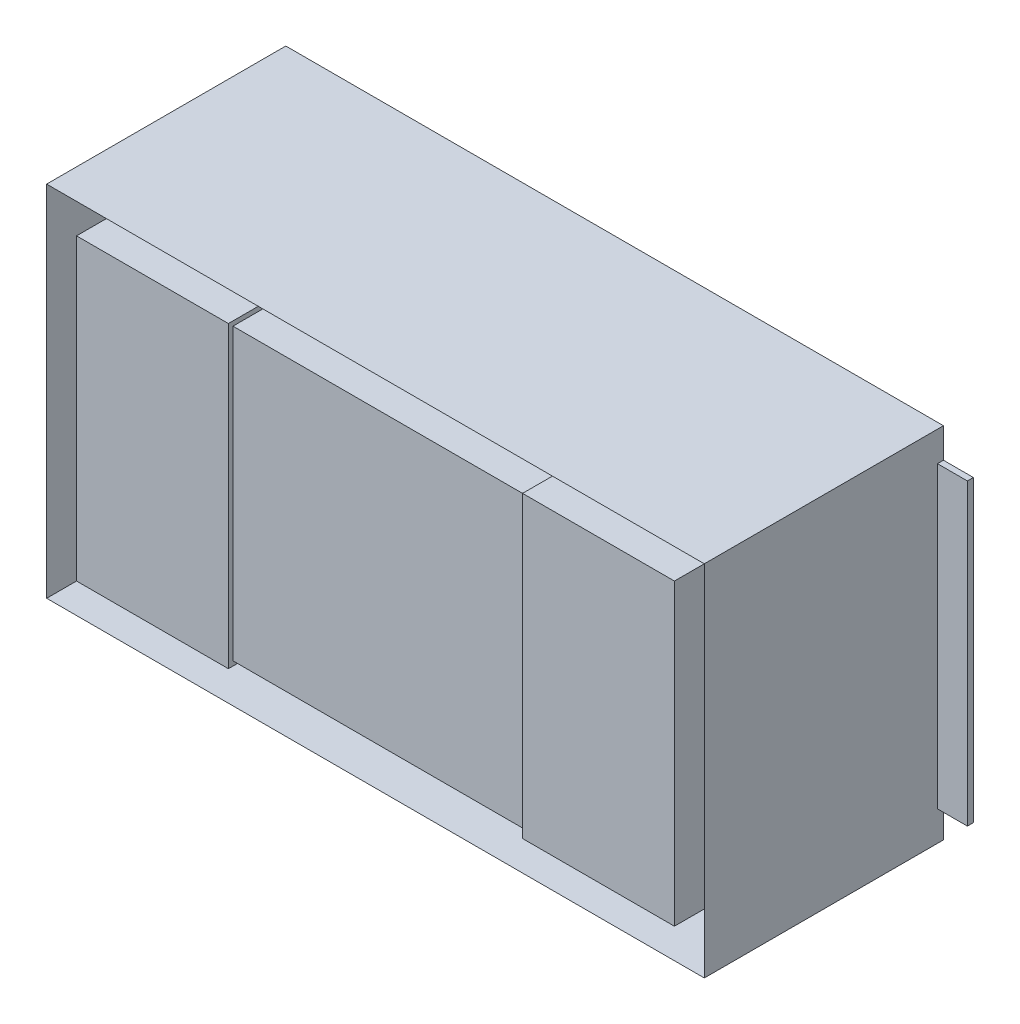
ISO-10303-21;
HEADER;
FILE_DESCRIPTION(('STEP AP214'),'2;1');
FILE_NAME('part.step','',(''),(''),'','','');
FILE_SCHEMA(('AUTOMOTIVE_DESIGN { 1 0 10303 214 1 1 1 1 }'));
ENDSEC;
DATA;
#1=APPLICATION_CONTEXT('core data for automotive mechanical design processes');
#2=APPLICATION_PROTOCOL_DEFINITION('international standard','automotive_design',2000,#1);
#3=PRODUCT_CONTEXT('',#1,'mechanical');
#4=PRODUCT('Part','Part','',(#3));
#5=PRODUCT_RELATED_PRODUCT_CATEGORY('part','',(#4));
#6=PRODUCT_DEFINITION_FORMATION('','',#4);
#7=PRODUCT_DEFINITION_CONTEXT('part definition',#1,'design');
#8=PRODUCT_DEFINITION('design','',#6,#7);
#9=PRODUCT_DEFINITION_SHAPE('','',#8);
#10=(LENGTH_UNIT() NAMED_UNIT(*) SI_UNIT(.MILLI.,.METRE.));
#11=(NAMED_UNIT(*) PLANE_ANGLE_UNIT() SI_UNIT($,.RADIAN.));
#12=(NAMED_UNIT(*) SI_UNIT($,.STERADIAN.) SOLID_ANGLE_UNIT());
#13=UNCERTAINTY_MEASURE_WITH_UNIT(LENGTH_MEASURE(1.E-05),#10,'distance_accuracy_value','');
#14=(GEOMETRIC_REPRESENTATION_CONTEXT(3) GLOBAL_UNCERTAINTY_ASSIGNED_CONTEXT((#13)) GLOBAL_UNIT_ASSIGNED_CONTEXT((#10,
#11,#12)) REPRESENTATION_CONTEXT('',''));
#15=CARTESIAN_POINT('',(0.,0.,0.));
#16=DIRECTION('',(0.,0.,1.));
#17=DIRECTION('',(1.,0.,0.));
#18=AXIS2_PLACEMENT_3D('',#15,#16,#17);
#19=CARTESIAN_POINT('',(-0.5999988,0.2500122,0.0762));
#20=DIRECTION('',(-1.,0.,0.));
#21=DIRECTION('',(0.,0.,1.));
#22=AXIS2_PLACEMENT_3D('',#19,#20,#21);
#23=PLANE('',#22);
#24=DIRECTION('',(0.,0.,1.));
#25=VECTOR('',#24,1.);
#26=CARTESIAN_POINT('',(-0.5999988,-0.2500081333333,0.0762));
#27=LINE('',#26,#25);
#28=CARTESIAN_POINT('',(-0.5999988,-0.2500081333333,0.0762));
#29=VERTEX_POINT('',#28);
#30=CARTESIAN_POINT('',(-0.5999988,-0.2500081333333,0.0862));
#31=VERTEX_POINT('',#30);
#32=EDGE_CURVE('P0_E355',#29,#31,#27,.T.);
#33=ORIENTED_EDGE('',*,*,#32,.T.);
#34=DIRECTION('',(0.,-1.,0.));
#35=VECTOR('',#34,1.);
#36=CARTESIAN_POINT('',(-0.5999988,0.2500081333333,0.0862));
#37=LINE('',#36,#35);
#38=CARTESIAN_POINT('',(-0.5999988,0.2500081333333,0.0862));
#39=VERTEX_POINT('',#38);
#40=EDGE_CURVE('P0_E276',#39,#31,#37,.T.);
#41=ORIENTED_EDGE('',*,*,#40,.F.);
#42=DIRECTION('',(0.,0.,1.));
#43=VECTOR('',#42,1.);
#44=CARTESIAN_POINT('',(-0.5999988,0.2500081333333,0.0762));
#45=LINE('',#44,#43);
#46=CARTESIAN_POINT('',(-0.5999988,0.2500081333333,0.0762));
#47=VERTEX_POINT('',#46);
#48=EDGE_CURVE('P0_E323',#47,#39,#45,.T.);
#49=ORIENTED_EDGE('',*,*,#48,.F.);
#50=DIRECTION('',(0.,-1.,0.));
#51=VECTOR('',#50,1.);
#52=CARTESIAN_POINT('',(-0.5999988,0.2500081333333,0.0762));
#53=LINE('',#52,#51);
#54=EDGE_CURVE('P0_E381',#47,#29,#53,.T.);
#55=ORIENTED_EDGE('',*,*,#54,.T.);
#56=EDGE_LOOP('',(#33,#41,#49,#55));
#57=FACE_BOUND('',#56,.T.);
#58=ADVANCED_FACE('P0_F18',(#57),#23,.T.);
#59=CARTESIAN_POINT('',(0.5999988,-0.2500122,0.0762));
#60=DIRECTION('',(1.,0.,0.));
#61=DIRECTION('',(0.,1.,0.));
#62=AXIS2_PLACEMENT_3D('',#59,#60,#61);
#63=PLANE('',#62);
#64=DIRECTION('',(0.,0.,1.));
#65=VECTOR('',#64,1.);
#66=CARTESIAN_POINT('',(0.5999988,0.2500081333333,0.0762));
#67=LINE('',#66,#65);
#68=CARTESIAN_POINT('',(0.5999988,0.2500081333333,0.0762));
#69=VERTEX_POINT('',#68);
#70=CARTESIAN_POINT('',(0.5999988,0.2500081333333,0.0862));
#71=VERTEX_POINT('',#70);
#72=EDGE_CURVE('P0_E421',#69,#71,#67,.T.);
#73=ORIENTED_EDGE('',*,*,#72,.T.);
#74=DIRECTION('',(0.,1.,0.));
#75=VECTOR('',#74,1.);
#76=CARTESIAN_POINT('',(0.5999988,-0.2500081333333,0.0862));
#77=LINE('',#76,#75);
#78=CARTESIAN_POINT('',(0.5999988,-0.2500081333333,0.0862));
#79=VERTEX_POINT('',#78);
#80=EDGE_CURVE('P0_E277',#79,#71,#77,.T.);
#81=ORIENTED_EDGE('',*,*,#80,.F.);
#82=DIRECTION('',(0.,0.,1.));
#83=VECTOR('',#82,1.);
#84=CARTESIAN_POINT('',(0.5999988,-0.2500081333333,0.0762));
#85=LINE('',#84,#83);
#86=CARTESIAN_POINT('',(0.5999988,-0.2500081333333,0.0762));
#87=VERTEX_POINT('',#86);
#88=EDGE_CURVE('P0_E404',#87,#79,#85,.T.);
#89=ORIENTED_EDGE('',*,*,#88,.F.);
#90=DIRECTION('',(0.,1.,0.));
#91=VECTOR('',#90,1.);
#92=CARTESIAN_POINT('',(0.5999988,-0.2500081333333,0.0762));
#93=LINE('',#92,#91);
#94=EDGE_CURVE('P0_E269',#87,#69,#93,.T.);
#95=ORIENTED_EDGE('',*,*,#94,.T.);
#96=EDGE_LOOP('',(#73,#81,#89,#95));
#97=FACE_BOUND('',#96,.T.);
#98=ADVANCED_FACE('P0_F541',(#97),#63,.T.);
#99=CARTESIAN_POINT('',(-0.5,0.25,0.0762));
#100=DIRECTION('',(-1.,0.,0.));
#101=DIRECTION('',(0.,0.,1.));
#102=AXIS2_PLACEMENT_3D('',#99,#100,#101);
#103=PLANE('',#102);
#104=DIRECTION('',(0.,1.04273504267004E-05,0.999999999945635));
#105=VECTOR('',#104,1.);
#106=CARTESIAN_POINT('',(-0.5,-0.2500040666667,0.0862));
#107=LINE('',#106,#105);
#108=CARTESIAN_POINT('',(-0.5,-0.2500040666667,0.0862));
#109=VERTEX_POINT('',#108);
#110=CARTESIAN_POINT('',(-0.5,-0.25,0.4762));
#111=VERTEX_POINT('',#110);
#112=EDGE_CURVE('P0_E352',#109,#111,#107,.T.);
#113=ORIENTED_EDGE('',*,*,#112,.T.);
#114=DIRECTION('',(0.,-1.,0.));
#115=VECTOR('',#114,1.);
#116=CARTESIAN_POINT('',(-0.5,0.25,0.4762));
#117=LINE('',#116,#115);
#118=CARTESIAN_POINT('',(-0.5,0.25,0.4762));
#119=VERTEX_POINT('',#118);
#120=EDGE_CURVE('P0_E11',#119,#111,#117,.T.);
#121=ORIENTED_EDGE('',*,*,#120,.F.);
#122=DIRECTION('',(0.,-1.04273504267004E-05,0.999999999945635));
#123=VECTOR('',#122,1.);
#124=CARTESIAN_POINT('',(-0.5,0.2500040666667,0.0862));
#125=LINE('',#124,#123);
#126=CARTESIAN_POINT('',(-0.5,0.2500040666667,0.0862));
#127=VERTEX_POINT('',#126);
#128=EDGE_CURVE('P0_E318',#127,#119,#125,.T.);
#129=ORIENTED_EDGE('',*,*,#128,.F.);
#130=DIRECTION('',(0.,-1.,0.));
#131=VECTOR('',#130,1.);
#132=CARTESIAN_POINT('',(-0.5,0.2500040666667,0.0862));
#133=LINE('',#132,#131);
#134=EDGE_CURVE('P0_E287',#127,#109,#133,.T.);
#135=ORIENTED_EDGE('',*,*,#134,.T.);
#136=EDGE_LOOP('',(#113,#121,#129,#135));
#137=FACE_BOUND('',#136,.T.);
#138=ADVANCED_FACE('P0_F549',(#137),#103,.T.);
#139=CARTESIAN_POINT('',(0.,0.,0.4762));
#140=DIRECTION('',(0.,0.,1.));
#141=DIRECTION('',(1.,0.,0.));
#142=AXIS2_PLACEMENT_3D('',#139,#140,#141);
#143=PLANE('',#142);
#144=DIRECTION('',(1.,0.,0.));
#145=VECTOR('',#144,1.);
#146=CARTESIAN_POINT('',(0.246,-0.25,0.4762));
#147=LINE('',#146,#145);
#148=CARTESIAN_POINT('',(0.246,-0.25,0.4762));
#149=VERTEX_POINT('',#148);
#150=CARTESIAN_POINT('',(0.5,-0.25,0.4762));
#151=VERTEX_POINT('',#150);
#152=EDGE_CURVE('P0_E247',#149,#151,#147,.T.);
#153=ORIENTED_EDGE('',*,*,#152,.T.);
#154=DIRECTION('',(0.,1.,0.));
#155=VECTOR('',#154,1.);
#156=CARTESIAN_POINT('',(0.5,-0.25,0.4762));
#157=LINE('',#156,#155);
#158=CARTESIAN_POINT('',(0.5,0.25,0.4762));
#159=VERTEX_POINT('',#158);
#160=EDGE_CURVE('P0_E286',#151,#159,#157,.T.);
#161=ORIENTED_EDGE('',*,*,#160,.T.);
#162=DIRECTION('',(-1.,0.,0.));
#163=VECTOR('',#162,1.);
#164=CARTESIAN_POINT('',(0.5,0.25,0.4762));
#165=LINE('',#164,#163);
#166=CARTESIAN_POINT('',(0.246,0.25,0.4762));
#167=VERTEX_POINT('',#166);
#168=EDGE_CURVE('P0_E415',#159,#167,#165,.T.);
#169=ORIENTED_EDGE('',*,*,#168,.T.);
#170=DIRECTION('',(0.,1.,0.));
#171=VECTOR('',#170,1.);
#172=CARTESIAN_POINT('',(0.246,-0.25,0.4762));
#173=LINE('',#172,#171);
#174=EDGE_CURVE('P0_E250',#149,#167,#173,.T.);
#175=ORIENTED_EDGE('',*,*,#174,.F.);
#176=EDGE_LOOP('',(#153,#161,#169,#175));
#177=FACE_BOUND('',#176,.T.);
#178=ADVANCED_FACE('P0_F578',(#177),#143,.T.);
#179=CARTESIAN_POINT('',(0.,0.,0.4762));
#180=DIRECTION('',(0.,0.,1.));
#181=DIRECTION('',(1.,0.,0.));
#182=AXIS2_PLACEMENT_3D('',#179,#180,#181);
#183=PLANE('',#182);
#184=DIRECTION('',(-1.,0.,0.));
#185=VECTOR('',#184,1.);
#186=CARTESIAN_POINT('',(-0.246,0.25,0.4762));
#187=LINE('',#186,#185);
#188=CARTESIAN_POINT('',(-0.246,0.25,0.4762));
#189=VERTEX_POINT('',#188);
#190=EDGE_CURVE('P0_E313',#189,#119,#187,.T.);
#191=ORIENTED_EDGE('',*,*,#190,.T.);
#192=ORIENTED_EDGE('',*,*,#120,.T.);
#193=DIRECTION('',(1.,0.,0.));
#194=VECTOR('',#193,1.);
#195=CARTESIAN_POINT('',(-0.5,-0.25,0.4762));
#196=LINE('',#195,#194);
#197=CARTESIAN_POINT('',(-0.246,-0.25,0.4762));
#198=VERTEX_POINT('',#197);
#199=EDGE_CURVE('P0_E356',#111,#198,#196,.T.);
#200=ORIENTED_EDGE('',*,*,#199,.T.);
#201=DIRECTION('',(0.,1.,0.));
#202=VECTOR('',#201,1.);
#203=CARTESIAN_POINT('',(-0.246,-0.25,0.4762));
#204=LINE('',#203,#202);
#205=EDGE_CURVE('P0_E29',#198,#189,#204,.T.);
#206=ORIENTED_EDGE('',*,*,#205,.T.);
#207=EDGE_LOOP('',(#191,#192,#200,#206));
#208=FACE_BOUND('',#207,.T.);
#209=ADVANCED_FACE('P0_F1244',(#208),#183,.T.);
#210=CARTESIAN_POINT('',(-0.246,-0.25,0.0762));
#211=DIRECTION('',(-1.,0.,0.));
#212=DIRECTION('',(0.,0.,1.));
#213=AXIS2_PLACEMENT_3D('',#210,#211,#212);
#214=PLANE('',#213);
#215=DIRECTION('',(0.,0.,-1.));
#216=VECTOR('',#215,1.);
#217=CARTESIAN_POINT('',(-0.246,-0.24238,0.46858));
#218=LINE('',#217,#216);
#219=CARTESIAN_POINT('',(-0.246,-0.24238,0.46858));
#220=VERTEX_POINT('',#219);
#221=CARTESIAN_POINT('',(-0.246,-0.24238,0.0862));
#222=VERTEX_POINT('',#221);
#223=EDGE_CURVE('P0_E43',#220,#222,#218,.T.);
#224=ORIENTED_EDGE('',*,*,#223,.F.);
#225=DIRECTION('',(0.,1.,0.));
#226=VECTOR('',#225,1.);
#227=CARTESIAN_POINT('',(-0.246,-0.24238,0.46858));
#228=LINE('',#227,#226);
#229=CARTESIAN_POINT('',(-0.246,0.24238,0.46858));
#230=VERTEX_POINT('',#229);
#231=EDGE_CURVE('P0_E267',#220,#230,#228,.T.);
#232=ORIENTED_EDGE('',*,*,#231,.T.);
#233=DIRECTION('',(0.,0.,-1.));
#234=VECTOR('',#233,1.);
#235=CARTESIAN_POINT('',(-0.246,0.24238,0.46858));
#236=LINE('',#235,#234);
#237=CARTESIAN_POINT('',(-0.246,0.24238,0.0862));
#238=VERTEX_POINT('',#237);
#239=EDGE_CURVE('P0_E300',#230,#238,#236,.T.);
#240=ORIENTED_EDGE('',*,*,#239,.T.);
#241=DIRECTION('',(0.,1.,0.));
#242=VECTOR('',#241,1.);
#243=CARTESIAN_POINT('',(-0.246,0.24238,0.0862));
#244=LINE('',#243,#242);
#245=CARTESIAN_POINT('',(-0.246,0.2500040666667,0.0862));
#246=VERTEX_POINT('',#245);
#247=EDGE_CURVE('P0_E22',#238,#246,#244,.T.);
#248=ORIENTED_EDGE('',*,*,#247,.T.);
#249=DIRECTION('',(0.,-1.04273504267004E-05,0.999999999945635));
#250=VECTOR('',#249,1.);
#251=CARTESIAN_POINT('',(-0.246,0.2500040666667,0.0862));
#252=LINE('',#251,#250);
#253=EDGE_CURVE('P0_E317',#246,#189,#252,.T.);
#254=ORIENTED_EDGE('',*,*,#253,.T.);
#255=ORIENTED_EDGE('',*,*,#205,.F.);
#256=DIRECTION('',(0.,1.04273504267004E-05,0.999999999945635));
#257=VECTOR('',#256,1.);
#258=CARTESIAN_POINT('',(-0.246,-0.2500040666667,0.0862));
#259=LINE('',#258,#257);
#260=CARTESIAN_POINT('',(-0.246,-0.2500040666667,0.0862));
#261=VERTEX_POINT('',#260);
#262=EDGE_CURVE('P0_E369',#261,#198,#259,.T.);
#263=ORIENTED_EDGE('',*,*,#262,.F.);
#264=DIRECTION('',(0.,1.,0.));
#265=VECTOR('',#264,1.);
#266=CARTESIAN_POINT('',(-0.246,-0.2500040666667,0.0862));
#267=LINE('',#266,#265);
#268=EDGE_CURVE('P0_E331',#261,#222,#267,.T.);
#269=ORIENTED_EDGE('',*,*,#268,.T.);
#270=EDGE_LOOP('',(#224,#232,#240,#248,#254,#255,#263,#269));
#271=FACE_BOUND('',#270,.T.);
#272=ADVANCED_FACE('P0_F506',(#271),#214,.F.);
#273=CARTESIAN_POINT('',(-0.246,-0.24238,0.4762));
#274=DIRECTION('',(0.,1.,0.));
#275=DIRECTION('',(1.,0.,0.));
#276=AXIS2_PLACEMENT_3D('',#273,#274,#275);
#277=PLANE('',#276);
#278=DIRECTION('',(0.,0.,1.));
#279=VECTOR('',#278,1.);
#280=CARTESIAN_POINT('',(-0.1999996,-0.24238,0.08382));
#281=LINE('',#280,#279);
#282=CARTESIAN_POINT('',(-0.1999996,-0.24238,0.08382));
#283=VERTEX_POINT('',#282);
#284=CARTESIAN_POINT('',(-0.1999996,-0.24238,0.0862));
#285=VERTEX_POINT('',#284);
#286=EDGE_CURVE('P0_E301',#283,#285,#281,.T.);
#287=ORIENTED_EDGE('',*,*,#286,.F.);
#288=DIRECTION('',(1.,0.,0.));
#289=VECTOR('',#288,1.);
#290=CARTESIAN_POINT('',(-0.1999996,-0.24238,0.08382));
#291=LINE('',#290,#289);
#292=CARTESIAN_POINT('',(0.1999996,-0.24238,0.08382));
#293=VERTEX_POINT('',#292);
#294=EDGE_CURVE('P0_E278',#283,#293,#291,.T.);
#295=ORIENTED_EDGE('',*,*,#294,.T.);
#296=DIRECTION('',(0.,0.,1.));
#297=VECTOR('',#296,1.);
#298=CARTESIAN_POINT('',(0.1999996,-0.24238,0.08382));
#299=LINE('',#298,#297);
#300=CARTESIAN_POINT('',(0.1999996,-0.24238,0.0862));
#301=VERTEX_POINT('',#300);
#302=EDGE_CURVE('P0_E361',#293,#301,#299,.T.);
#303=ORIENTED_EDGE('',*,*,#302,.T.);
#304=DIRECTION('',(1.,0.,0.));
#305=VECTOR('',#304,1.);
#306=CARTESIAN_POINT('',(0.1999996,-0.24238,0.0862));
#307=LINE('',#306,#305);
#308=CARTESIAN_POINT('',(0.246,-0.24238,0.0862));
#309=VERTEX_POINT('',#308);
#310=EDGE_CURVE('P0_E310',#301,#309,#307,.T.);
#311=ORIENTED_EDGE('',*,*,#310,.T.);
#312=DIRECTION('',(0.,0.,-1.));
#313=VECTOR('',#312,1.);
#314=CARTESIAN_POINT('',(0.246,-0.24238,0.46858));
#315=LINE('',#314,#313);
#316=CARTESIAN_POINT('',(0.246,-0.24238,0.46858));
#317=VERTEX_POINT('',#316);
#318=EDGE_CURVE('P0_E241',#317,#309,#315,.T.);
#319=ORIENTED_EDGE('',*,*,#318,.F.);
#320=DIRECTION('',(1.,0.,0.));
#321=VECTOR('',#320,1.);
#322=CARTESIAN_POINT('',(-0.246,-0.24238,0.46858));
#323=LINE('',#322,#321);
#324=EDGE_CURVE('P0_E366',#220,#317,#323,.T.);
#325=ORIENTED_EDGE('',*,*,#324,.F.);
#326=ORIENTED_EDGE('',*,*,#223,.T.);
#327=DIRECTION('',(1.,0.,0.));
#328=VECTOR('',#327,1.);
#329=CARTESIAN_POINT('',(-0.246,-0.24238,0.0862));
#330=LINE('',#329,#328);
#331=EDGE_CURVE('P0_E333',#222,#285,#330,.T.);
#332=ORIENTED_EDGE('',*,*,#331,.T.);
#333=EDGE_LOOP('',(#287,#295,#303,#311,#319,#325,#326,#332));
#334=FACE_BOUND('',#333,.T.);
#335=ADVANCED_FACE('P0_F510',(#334),#277,.F.);
#336=CARTESIAN_POINT('',(-0.246,0.25,0.46858));
#337=DIRECTION('',(0.,0.,-1.));
#338=DIRECTION('',(0.,-1.,0.));
#339=AXIS2_PLACEMENT_3D('',#336,#337,#338);
#340=PLANE('',#339);
#341=ORIENTED_EDGE('',*,*,#231,.F.);
#342=ORIENTED_EDGE('',*,*,#324,.T.);
#343=DIRECTION('',(0.,1.,0.));
#344=VECTOR('',#343,1.);
#345=CARTESIAN_POINT('',(0.246,-0.24238,0.46858));
#346=LINE('',#345,#344);
#347=CARTESIAN_POINT('',(0.246,0.24238,0.46858));
#348=VERTEX_POINT('',#347);
#349=EDGE_CURVE('P0_E302',#317,#348,#346,.T.);
#350=ORIENTED_EDGE('',*,*,#349,.T.);
#351=DIRECTION('',(-1.,0.,0.));
#352=VECTOR('',#351,1.);
#353=CARTESIAN_POINT('',(0.246,0.24238,0.46858));
#354=LINE('',#353,#352);
#355=EDGE_CURVE('P0_E490',#348,#230,#354,.T.);
#356=ORIENTED_EDGE('',*,*,#355,.T.);
#357=EDGE_LOOP('',(#341,#342,#350,#356));
#358=FACE_BOUND('',#357,.T.);
#359=ADVANCED_FACE('P0_F508',(#358),#340,.F.);
#360=CARTESIAN_POINT('',(-0.246,0.24238,0.0762));
#361=DIRECTION('',(0.,-1.,0.));
#362=DIRECTION('',(0.,0.,-1.));
#363=AXIS2_PLACEMENT_3D('',#360,#361,#362);
#364=PLANE('',#363);
#365=ORIENTED_EDGE('',*,*,#239,.F.);
#366=ORIENTED_EDGE('',*,*,#355,.F.);
#367=DIRECTION('',(0.,0.,-1.));
#368=VECTOR('',#367,1.);
#369=CARTESIAN_POINT('',(0.246,0.24238,0.46858));
#370=LINE('',#369,#368);
#371=CARTESIAN_POINT('',(0.246,0.24238,0.0862));
#372=VERTEX_POINT('',#371);
#373=EDGE_CURVE('P0_E306',#348,#372,#370,.T.);
#374=ORIENTED_EDGE('',*,*,#373,.T.);
#375=DIRECTION('',(1.,0.,0.));
#376=VECTOR('',#375,1.);
#377=CARTESIAN_POINT('',(0.1999996,0.24238,0.0862));
#378=LINE('',#377,#376);
#379=CARTESIAN_POINT('',(0.1999996,0.24238,0.0862));
#380=VERTEX_POINT('',#379);
#381=EDGE_CURVE('P0_E283',#380,#372,#378,.T.);
#382=ORIENTED_EDGE('',*,*,#381,.F.);
#383=DIRECTION('',(0.,0.,1.));
#384=VECTOR('',#383,1.);
#385=CARTESIAN_POINT('',(0.1999996,0.24238,0.08382));
#386=LINE('',#385,#384);
#387=CARTESIAN_POINT('',(0.1999996,0.24238,0.08382));
#388=VERTEX_POINT('',#387);
#389=EDGE_CURVE('P0_E365',#388,#380,#386,.T.);
#390=ORIENTED_EDGE('',*,*,#389,.F.);
#391=DIRECTION('',(-1.,0.,0.));
#392=VECTOR('',#391,1.);
#393=CARTESIAN_POINT('',(0.1999996,0.24238,0.08382));
#394=LINE('',#393,#392);
#395=CARTESIAN_POINT('',(-0.1999996,0.24238,0.08382));
#396=VERTEX_POINT('',#395);
#397=EDGE_CURVE('P0_E282',#388,#396,#394,.T.);
#398=ORIENTED_EDGE('',*,*,#397,.T.);
#399=DIRECTION('',(0.,0.,1.));
#400=VECTOR('',#399,1.);
#401=CARTESIAN_POINT('',(-0.1999996,0.24238,0.08382));
#402=LINE('',#401,#400);
#403=CARTESIAN_POINT('',(-0.1999996,0.24238,0.0862));
#404=VERTEX_POINT('',#403);
#405=EDGE_CURVE('P0_E297',#396,#404,#402,.T.);
#406=ORIENTED_EDGE('',*,*,#405,.T.);
#407=DIRECTION('',(1.,0.,0.));
#408=VECTOR('',#407,1.);
#409=CARTESIAN_POINT('',(-0.246,0.24238,0.0862));
#410=LINE('',#409,#408);
#411=EDGE_CURVE('P0_E329',#238,#404,#410,.T.);
#412=ORIENTED_EDGE('',*,*,#411,.F.);
#413=EDGE_LOOP('',(#365,#366,#374,#382,#390,#398,#406,#412));
#414=FACE_BOUND('',#413,.T.);
#415=ADVANCED_FACE('P0_F523',(#414),#364,.F.);
#416=CARTESIAN_POINT('',(-0.1999996,-0.2500122,0.0762));
#417=DIRECTION('',(1.,0.,0.));
#418=DIRECTION('',(0.,1.,0.));
#419=AXIS2_PLACEMENT_3D('',#416,#417,#418);
#420=PLANE('',#419);
#421=ORIENTED_EDGE('',*,*,#286,.T.);
#422=DIRECTION('',(0.,1.,0.));
#423=VECTOR('',#422,1.);
#424=CARTESIAN_POINT('',(-0.1999996,-0.2500081333333,0.0862));
#425=LINE('',#424,#423);
#426=CARTESIAN_POINT('',(-0.1999996,-0.2500081333333,0.0862));
#427=VERTEX_POINT('',#426);
#428=EDGE_CURVE('P0_E357',#427,#285,#425,.T.);
#429=ORIENTED_EDGE('',*,*,#428,.F.);
#430=DIRECTION('',(0.,0.,1.));
#431=VECTOR('',#430,1.);
#432=CARTESIAN_POINT('',(-0.1999996,-0.2500081333333,0.0762));
#433=LINE('',#432,#431);
#434=CARTESIAN_POINT('',(-0.1999996,-0.2500081333333,0.0762));
#435=VERTEX_POINT('',#434);
#436=EDGE_CURVE('P0_E373',#435,#427,#433,.T.);
#437=ORIENTED_EDGE('',*,*,#436,.F.);
#438=DIRECTION('',(0.,1.,0.));
#439=VECTOR('',#438,1.);
#440=CARTESIAN_POINT('',(-0.1999996,-0.2500081333333,0.0762));
#441=LINE('',#440,#439);
#442=CARTESIAN_POINT('',(-0.1999996,0.2500081333333,0.0762));
#443=VERTEX_POINT('',#442);
#444=EDGE_CURVE('P0_E397',#435,#443,#441,.T.);
#445=ORIENTED_EDGE('',*,*,#444,.T.);
#446=DIRECTION('',(0.,0.,1.));
#447=VECTOR('',#446,1.);
#448=CARTESIAN_POINT('',(-0.1999996,0.2500081333333,0.0762));
#449=LINE('',#448,#447);
#450=CARTESIAN_POINT('',(-0.1999996,0.2500081333333,0.0862));
#451=VERTEX_POINT('',#450);
#452=EDGE_CURVE('P0_E251',#443,#451,#449,.T.);
#453=ORIENTED_EDGE('',*,*,#452,.T.);
#454=DIRECTION('',(0.,1.,0.));
#455=VECTOR('',#454,1.);
#456=CARTESIAN_POINT('',(-0.1999996,0.24238,0.0862));
#457=LINE('',#456,#455);
#458=EDGE_CURVE('P0_E327',#404,#451,#457,.T.);
#459=ORIENTED_EDGE('',*,*,#458,.F.);
#460=ORIENTED_EDGE('',*,*,#405,.F.);
#461=DIRECTION('',(0.,1.,0.));
#462=VECTOR('',#461,1.);
#463=CARTESIAN_POINT('',(-0.1999996,-0.24238,0.08382));
#464=LINE('',#463,#462);
#465=EDGE_CURVE('P0_E281',#283,#396,#464,.T.);
#466=ORIENTED_EDGE('',*,*,#465,.F.);
#467=EDGE_LOOP('',(#421,#429,#437,#445,#453,#459,#460,#466));
#468=FACE_BOUND('',#467,.T.);
#469=ADVANCED_FACE('P0_F526',(#468),#420,.T.);
#470=CARTESIAN_POINT('',(-0.246,-0.25,0.08382));
#471=DIRECTION('',(0.,0.,1.));
#472=DIRECTION('',(1.,0.,0.));
#473=AXIS2_PLACEMENT_3D('',#470,#471,#472);
#474=PLANE('',#473);
#475=ORIENTED_EDGE('',*,*,#397,.F.);
#476=DIRECTION('',(0.,1.,0.));
#477=VECTOR('',#476,1.);
#478=CARTESIAN_POINT('',(0.1999996,-0.24238,0.08382));
#479=LINE('',#478,#477);
#480=EDGE_CURVE('P0_E364',#293,#388,#479,.T.);
#481=ORIENTED_EDGE('',*,*,#480,.F.);
#482=ORIENTED_EDGE('',*,*,#294,.F.);
#483=ORIENTED_EDGE('',*,*,#465,.T.);
#484=EDGE_LOOP('',(#475,#481,#482,#483));
#485=FACE_BOUND('',#484,.T.);
#486=ADVANCED_FACE('P0_F533',(#485),#474,.F.);
#487=CARTESIAN_POINT('',(0.1999996,0.2500122,0.0762));
#488=DIRECTION('',(-1.,0.,0.));
#489=DIRECTION('',(0.,0.,1.));
#490=AXIS2_PLACEMENT_3D('',#487,#488,#489);
#491=PLANE('',#490);
#492=ORIENTED_EDGE('',*,*,#389,.T.);
#493=DIRECTION('',(0.,-1.,0.));
#494=VECTOR('',#493,1.);
#495=CARTESIAN_POINT('',(0.1999996,0.2500081333333,0.0862));
#496=LINE('',#495,#494);
#497=CARTESIAN_POINT('',(0.1999996,0.2500081333333,0.0862));
#498=VERTEX_POINT('',#497);
#499=EDGE_CURVE('P0_E233',#498,#380,#496,.T.);
#500=ORIENTED_EDGE('',*,*,#499,.F.);
#501=DIRECTION('',(0.,0.,1.));
#502=VECTOR('',#501,1.);
#503=CARTESIAN_POINT('',(0.1999996,0.2500081333333,0.0762));
#504=LINE('',#503,#502);
#505=CARTESIAN_POINT('',(0.1999996,0.2500081333333,0.0762));
#506=VERTEX_POINT('',#505);
#507=EDGE_CURVE('P0_E393',#506,#498,#504,.T.);
#508=ORIENTED_EDGE('',*,*,#507,.F.);
#509=DIRECTION('',(0.,-1.,0.));
#510=VECTOR('',#509,1.);
#511=CARTESIAN_POINT('',(0.1999996,0.2500081333333,0.0762));
#512=LINE('',#511,#510);
#513=CARTESIAN_POINT('',(0.1999996,-0.2500081333333,0.0762));
#514=VERTEX_POINT('',#513);
#515=EDGE_CURVE('P0_E296',#506,#514,#512,.T.);
#516=ORIENTED_EDGE('',*,*,#515,.T.);
#517=DIRECTION('',(0.,0.,1.));
#518=VECTOR('',#517,1.);
#519=CARTESIAN_POINT('',(0.1999996,-0.2500081333333,0.0762));
#520=LINE('',#519,#518);
#521=CARTESIAN_POINT('',(0.1999996,-0.2500081333333,0.0862));
#522=VERTEX_POINT('',#521);
#523=EDGE_CURVE('P0_E403',#514,#522,#520,.T.);
#524=ORIENTED_EDGE('',*,*,#523,.T.);
#525=DIRECTION('',(0.,-1.,0.));
#526=VECTOR('',#525,1.);
#527=CARTESIAN_POINT('',(0.1999996,-0.24238,0.0862));
#528=LINE('',#527,#526);
#529=EDGE_CURVE('P0_E229',#301,#522,#528,.T.);
#530=ORIENTED_EDGE('',*,*,#529,.F.);
#531=ORIENTED_EDGE('',*,*,#302,.F.);
#532=ORIENTED_EDGE('',*,*,#480,.T.);
#533=EDGE_LOOP('',(#492,#500,#508,#516,#524,#530,#531,#532));
#534=FACE_BOUND('',#533,.T.);
#535=ADVANCED_FACE('P0_F519',(#534),#491,.T.);
#536=CARTESIAN_POINT('',(-0.5,-0.25,0.0762));
#537=DIRECTION('',(0.,-1.,0.));
#538=DIRECTION('',(0.,0.,-1.));
#539=AXIS2_PLACEMENT_3D('',#536,#537,#538);
#540=PLANE('',#539);
#541=ORIENTED_EDGE('',*,*,#199,.F.);
#542=ORIENTED_EDGE('',*,*,#112,.F.);
#543=DIRECTION('',(0.999999999173091,4.06671546391397E-05,0.));
#544=VECTOR('',#543,1.);
#545=CARTESIAN_POINT('',(-0.5999988,-0.2500081333333,0.0862));
#546=LINE('',#545,#544);
#547=EDGE_CURVE('P0_E292',#31,#109,#546,.T.);
#548=ORIENTED_EDGE('',*,*,#547,.F.);
#549=ORIENTED_EDGE('',*,*,#32,.F.);
#550=DIRECTION('',(-1.,0.,0.));
#551=VECTOR('',#550,1.);
#552=CARTESIAN_POINT('',(-0.1999996,-0.2500081333333,0.0762));
#553=LINE('',#552,#551);
#554=EDGE_CURVE('P0_E420',#435,#29,#553,.T.);
#555=ORIENTED_EDGE('',*,*,#554,.F.);
#556=ORIENTED_EDGE('',*,*,#436,.T.);
#557=DIRECTION('',(0.999999996092276,-8.84050280171378E-05,0.));
#558=VECTOR('',#557,1.);
#559=CARTESIAN_POINT('',(-0.246,-0.2500040666667,0.0862));
#560=LINE('',#559,#558);
#561=EDGE_CURVE('P0_E291',#261,#427,#560,.T.);
#562=ORIENTED_EDGE('',*,*,#561,.F.);
#563=ORIENTED_EDGE('',*,*,#262,.T.);
#564=EDGE_LOOP('',(#541,#542,#548,#549,#555,#556,#562,#563));
#565=FACE_BOUND('',#564,.T.);
#566=ADVANCED_FACE('P0_F20',(#565),#540,.T.);
#567=CARTESIAN_POINT('',(-0.5,-0.25,0.0762));
#568=DIRECTION('',(0.,-1.,0.));
#569=DIRECTION('',(0.,0.,-1.));
#570=AXIS2_PLACEMENT_3D('',#567,#568,#569);
#571=PLANE('',#570);
#572=ORIENTED_EDGE('',*,*,#88,.T.);
#573=DIRECTION('',(0.999999999173091,-4.06671546391397E-05,0.));
#574=VECTOR('',#573,1.);
#575=CARTESIAN_POINT('',(0.5,-0.2500040666667,0.0862));
#576=LINE('',#575,#574);
#577=CARTESIAN_POINT('',(0.5,-0.2500040666667,0.0862));
#578=VERTEX_POINT('',#577);
#579=EDGE_CURVE('P0_E243',#578,#79,#576,.T.);
#580=ORIENTED_EDGE('',*,*,#579,.F.);
#581=DIRECTION('',(0.,1.04273504267004E-05,0.999999999945635));
#582=VECTOR('',#581,1.);
#583=CARTESIAN_POINT('',(0.5,-0.2500040666667,0.0862));
#584=LINE('',#583,#582);
#585=EDGE_CURVE('P0_E428',#578,#151,#584,.T.);
#586=ORIENTED_EDGE('',*,*,#585,.T.);
#587=ORIENTED_EDGE('',*,*,#152,.F.);
#588=DIRECTION('',(0.,1.04273504267004E-05,0.999999999945635));
#589=VECTOR('',#588,1.);
#590=CARTESIAN_POINT('',(0.246,-0.2500040666667,0.0862));
#591=LINE('',#590,#589);
#592=CARTESIAN_POINT('',(0.246,-0.2500040666667,0.0862));
#593=VERTEX_POINT('',#592);
#594=EDGE_CURVE('P0_E238',#593,#149,#591,.T.);
#595=ORIENTED_EDGE('',*,*,#594,.F.);
#596=DIRECTION('',(0.999999996092276,8.84050280171378E-05,0.));
#597=VECTOR('',#596,1.);
#598=CARTESIAN_POINT('',(0.1999996,-0.2500081333333,0.0862));
#599=LINE('',#598,#597);
#600=EDGE_CURVE('P0_E222',#522,#593,#599,.T.);
#601=ORIENTED_EDGE('',*,*,#600,.F.);
#602=ORIENTED_EDGE('',*,*,#523,.F.);
#603=DIRECTION('',(-1.,0.,0.));
#604=VECTOR('',#603,1.);
#605=CARTESIAN_POINT('',(0.5999988,-0.2500081333333,0.0762));
#606=LINE('',#605,#604);
#607=EDGE_CURVE('P0_E272',#87,#514,#606,.T.);
#608=ORIENTED_EDGE('',*,*,#607,.F.);
#609=EDGE_LOOP('',(#572,#580,#586,#587,#595,#601,#602,#608));
#610=FACE_BOUND('',#609,.T.);
#611=ADVANCED_FACE('P0_F245',(#610),#571,.T.);
#612=CARTESIAN_POINT('',(0.5,-0.25,0.0762));
#613=DIRECTION('',(1.,0.,0.));
#614=DIRECTION('',(0.,1.,0.));
#615=AXIS2_PLACEMENT_3D('',#612,#613,#614);
#616=PLANE('',#615);
#617=DIRECTION('',(0.,-1.04273504267004E-05,0.999999999945635));
#618=VECTOR('',#617,1.);
#619=CARTESIAN_POINT('',(0.5,0.2500040666667,0.0862));
#620=LINE('',#619,#618);
#621=CARTESIAN_POINT('',(0.5,0.2500040666667,0.0862));
#622=VERTEX_POINT('',#621);
#623=EDGE_CURVE('P0_E419',#622,#159,#620,.T.);
#624=ORIENTED_EDGE('',*,*,#623,.T.);
#625=ORIENTED_EDGE('',*,*,#160,.F.);
#626=ORIENTED_EDGE('',*,*,#585,.F.);
#627=DIRECTION('',(0.,1.,0.));
#628=VECTOR('',#627,1.);
#629=CARTESIAN_POINT('',(0.5,-0.2500040666667,0.0862));
#630=LINE('',#629,#628);
#631=EDGE_CURVE('P0_E273',#578,#622,#630,.T.);
#632=ORIENTED_EDGE('',*,*,#631,.T.);
#633=EDGE_LOOP('',(#624,#625,#626,#632));
#634=FACE_BOUND('',#633,.T.);
#635=ADVANCED_FACE('P0_F562',(#634),#616,.T.);
#636=CARTESIAN_POINT('',(0.,0.,0.0862));
#637=DIRECTION('',(0.,0.,1.));
#638=DIRECTION('',(1.,0.,0.));
#639=AXIS2_PLACEMENT_3D('',#636,#637,#638);
#640=PLANE('',#639);
#641=DIRECTION('',(-0.999999996092276,8.84050280171378E-05,0.));
#642=VECTOR('',#641,1.);
#643=CARTESIAN_POINT('',(0.246,0.2500040666667,0.0862));
#644=LINE('',#643,#642);
#645=CARTESIAN_POINT('',(0.246,0.2500040666667,0.0862));
#646=VERTEX_POINT('',#645);
#647=EDGE_CURVE('P0_E324',#646,#498,#644,.T.);
#648=ORIENTED_EDGE('',*,*,#647,.T.);
#649=ORIENTED_EDGE('',*,*,#499,.T.);
#650=ORIENTED_EDGE('',*,*,#381,.T.);
#651=DIRECTION('',(0.,1.,0.));
#652=VECTOR('',#651,1.);
#653=CARTESIAN_POINT('',(0.246,0.24238,0.0862));
#654=LINE('',#653,#652);
#655=EDGE_CURVE('P0_E259',#372,#646,#654,.T.);
#656=ORIENTED_EDGE('',*,*,#655,.T.);
#657=EDGE_LOOP('',(#648,#649,#650,#656));
#658=FACE_BOUND('',#657,.T.);
#659=ADVANCED_FACE('P0_F517',(#658),#640,.T.);
#660=CARTESIAN_POINT('',(0.,0.,0.0862));
#661=DIRECTION('',(0.,0.,1.));
#662=DIRECTION('',(1.,0.,0.));
#663=AXIS2_PLACEMENT_3D('',#660,#661,#662);
#664=PLANE('',#663);
#665=ORIENTED_EDGE('',*,*,#310,.F.);
#666=ORIENTED_EDGE('',*,*,#529,.T.);
#667=ORIENTED_EDGE('',*,*,#600,.T.);
#668=DIRECTION('',(0.,1.,0.));
#669=VECTOR('',#668,1.);
#670=CARTESIAN_POINT('',(0.246,-0.2500040666667,0.0862));
#671=LINE('',#670,#669);
#672=EDGE_CURVE('P0_E226',#593,#309,#671,.T.);
#673=ORIENTED_EDGE('',*,*,#672,.T.);
#674=EDGE_LOOP('',(#665,#666,#667,#673));
#675=FACE_BOUND('',#674,.T.);
#676=ADVANCED_FACE('P0_F225',(#675),#664,.T.);
#677=CARTESIAN_POINT('',(0.,0.,0.0862));
#678=DIRECTION('',(0.,0.,1.));
#679=DIRECTION('',(1.,0.,0.));
#680=AXIS2_PLACEMENT_3D('',#677,#678,#679);
#681=PLANE('',#680);
#682=ORIENTED_EDGE('',*,*,#411,.T.);
#683=ORIENTED_EDGE('',*,*,#458,.T.);
#684=DIRECTION('',(-0.999999996092276,-8.84050280171378E-05,0.));
#685=VECTOR('',#684,1.);
#686=CARTESIAN_POINT('',(-0.1999996,0.2500081333333,0.0862));
#687=LINE('',#686,#685);
#688=EDGE_CURVE('P0_E263',#451,#246,#687,.T.);
#689=ORIENTED_EDGE('',*,*,#688,.T.);
#690=ORIENTED_EDGE('',*,*,#247,.F.);
#691=EDGE_LOOP('',(#682,#683,#689,#690));
#692=FACE_BOUND('',#691,.T.);
#693=ADVANCED_FACE('P0_F557',(#692),#681,.T.);
#694=CARTESIAN_POINT('',(0.,0.,0.0862));
#695=DIRECTION('',(0.,0.,1.));
#696=DIRECTION('',(1.,0.,0.));
#697=AXIS2_PLACEMENT_3D('',#694,#695,#696);
#698=PLANE('',#697);
#699=ORIENTED_EDGE('',*,*,#561,.T.);
#700=ORIENTED_EDGE('',*,*,#428,.T.);
#701=ORIENTED_EDGE('',*,*,#331,.F.);
#702=ORIENTED_EDGE('',*,*,#268,.F.);
#703=EDGE_LOOP('',(#699,#700,#701,#702));
#704=FACE_BOUND('',#703,.T.);
#705=ADVANCED_FACE('P0_F558',(#704),#698,.T.);
#706=CARTESIAN_POINT('',(0.,0.,0.0862));
#707=DIRECTION('',(0.,0.,1.));
#708=DIRECTION('',(1.,0.,0.));
#709=AXIS2_PLACEMENT_3D('',#706,#707,#708);
#710=PLANE('',#709);
#711=DIRECTION('',(-0.999999999173091,4.06671546391397E-05,0.));
#712=VECTOR('',#711,1.);
#713=CARTESIAN_POINT('',(-0.5,0.2500040666667,0.0862));
#714=LINE('',#713,#712);
#715=EDGE_CURVE('P0_E390',#127,#39,#714,.T.);
#716=ORIENTED_EDGE('',*,*,#715,.T.);
#717=ORIENTED_EDGE('',*,*,#40,.T.);
#718=ORIENTED_EDGE('',*,*,#547,.T.);
#719=ORIENTED_EDGE('',*,*,#134,.F.);
#720=EDGE_LOOP('',(#716,#717,#718,#719));
#721=FACE_BOUND('',#720,.T.);
#722=ADVANCED_FACE('P0_F560',(#721),#710,.T.);
#723=CARTESIAN_POINT('',(0.,0.,0.0862));
#724=DIRECTION('',(0.,0.,1.));
#725=DIRECTION('',(1.,0.,0.));
#726=AXIS2_PLACEMENT_3D('',#723,#724,#725);
#727=PLANE('',#726);
#728=ORIENTED_EDGE('',*,*,#579,.T.);
#729=ORIENTED_EDGE('',*,*,#80,.T.);
#730=DIRECTION('',(-0.999999999173091,-4.06671546391397E-05,0.));
#731=VECTOR('',#730,1.);
#732=CARTESIAN_POINT('',(0.5999988,0.2500081333333,0.0862));
#733=LINE('',#732,#731);
#734=EDGE_CURVE('P0_E425',#71,#622,#733,.T.);
#735=ORIENTED_EDGE('',*,*,#734,.T.);
#736=ORIENTED_EDGE('',*,*,#631,.F.);
#737=EDGE_LOOP('',(#728,#729,#735,#736));
#738=FACE_BOUND('',#737,.T.);
#739=ADVANCED_FACE('P0_F581',(#738),#727,.T.);
#740=CARTESIAN_POINT('',(0.246,-0.25,0.08382));
#741=DIRECTION('',(1.,0.,0.));
#742=DIRECTION('',(0.,1.,0.));
#743=AXIS2_PLACEMENT_3D('',#740,#741,#742);
#744=PLANE('',#743);
#745=ORIENTED_EDGE('',*,*,#594,.T.);
#746=ORIENTED_EDGE('',*,*,#174,.T.);
#747=DIRECTION('',(0.,-1.04273504267004E-05,0.999999999945635));
#748=VECTOR('',#747,1.);
#749=CARTESIAN_POINT('',(0.246,0.2500040666667,0.0862));
#750=LINE('',#749,#748);
#751=EDGE_CURVE('P0_E319',#646,#167,#750,.T.);
#752=ORIENTED_EDGE('',*,*,#751,.F.);
#753=ORIENTED_EDGE('',*,*,#655,.F.);
#754=ORIENTED_EDGE('',*,*,#373,.F.);
#755=ORIENTED_EDGE('',*,*,#349,.F.);
#756=ORIENTED_EDGE('',*,*,#318,.T.);
#757=ORIENTED_EDGE('',*,*,#672,.F.);
#758=EDGE_LOOP('',(#745,#746,#752,#753,#754,#755,#756,#757));
#759=FACE_BOUND('',#758,.T.);
#760=ADVANCED_FACE('P0_F237',(#759),#744,.F.);
#761=CARTESIAN_POINT('',(0.5,0.25,0.0762));
#762=DIRECTION('',(0.,1.,0.));
#763=DIRECTION('',(1.,0.,0.));
#764=AXIS2_PLACEMENT_3D('',#761,#762,#763);
#765=PLANE('',#764);
#766=ORIENTED_EDGE('',*,*,#48,.T.);
#767=ORIENTED_EDGE('',*,*,#715,.F.);
#768=ORIENTED_EDGE('',*,*,#128,.T.);
#769=ORIENTED_EDGE('',*,*,#190,.F.);
#770=ORIENTED_EDGE('',*,*,#253,.F.);
#771=ORIENTED_EDGE('',*,*,#688,.F.);
#772=ORIENTED_EDGE('',*,*,#452,.F.);
#773=DIRECTION('',(1.,0.,0.));
#774=VECTOR('',#773,1.);
#775=CARTESIAN_POINT('',(-0.5999988,0.2500081333333,0.0762));
#776=LINE('',#775,#774);
#777=EDGE_CURVE('P0_E384',#47,#443,#776,.T.);
#778=ORIENTED_EDGE('',*,*,#777,.F.);
#779=EDGE_LOOP('',(#766,#767,#768,#769,#770,#771,#772,#778));
#780=FACE_BOUND('',#779,.T.);
#781=ADVANCED_FACE('P0_F617',(#780),#765,.T.);
#782=CARTESIAN_POINT('',(0.5,0.25,0.0762));
#783=DIRECTION('',(0.,1.,0.));
#784=DIRECTION('',(1.,0.,0.));
#785=AXIS2_PLACEMENT_3D('',#782,#783,#784);
#786=PLANE('',#785);
#787=ORIENTED_EDGE('',*,*,#168,.F.);
#788=ORIENTED_EDGE('',*,*,#623,.F.);
#789=ORIENTED_EDGE('',*,*,#734,.F.);
#790=ORIENTED_EDGE('',*,*,#72,.F.);
#791=DIRECTION('',(1.,0.,0.));
#792=VECTOR('',#791,1.);
#793=CARTESIAN_POINT('',(0.1999996,0.2500081333333,0.0762));
#794=LINE('',#793,#792);
#795=EDGE_CURVE('P0_E385',#506,#69,#794,.T.);
#796=ORIENTED_EDGE('',*,*,#795,.F.);
#797=ORIENTED_EDGE('',*,*,#507,.T.);
#798=ORIENTED_EDGE('',*,*,#647,.F.);
#799=ORIENTED_EDGE('',*,*,#751,.T.);
#800=EDGE_LOOP('',(#787,#788,#789,#790,#796,#797,#798,#799));
#801=FACE_BOUND('',#800,.T.);
#802=ADVANCED_FACE('P0_F514',(#801),#786,.T.);
#803=CARTESIAN_POINT('',(0.,0.,0.0762));
#804=DIRECTION('',(0.,0.,1.));
#805=DIRECTION('',(1.,0.,0.));
#806=AXIS2_PLACEMENT_3D('',#803,#804,#805);
#807=PLANE('',#806);
#808=ORIENTED_EDGE('',*,*,#54,.F.);
#809=ORIENTED_EDGE('',*,*,#777,.T.);
#810=ORIENTED_EDGE('',*,*,#444,.F.);
#811=ORIENTED_EDGE('',*,*,#554,.T.);
#812=EDGE_LOOP('',(#808,#809,#810,#811));
#813=FACE_BOUND('',#812,.T.);
#814=ADVANCED_FACE('P0_F610',(#813),#807,.F.);
#815=CARTESIAN_POINT('',(0.,0.,0.0762));
#816=DIRECTION('',(0.,0.,1.));
#817=DIRECTION('',(1.,0.,0.));
#818=AXIS2_PLACEMENT_3D('',#815,#816,#817);
#819=PLANE('',#818);
#820=ORIENTED_EDGE('',*,*,#94,.F.);
#821=ORIENTED_EDGE('',*,*,#607,.T.);
#822=ORIENTED_EDGE('',*,*,#515,.F.);
#823=ORIENTED_EDGE('',*,*,#795,.T.);
#824=EDGE_LOOP('',(#820,#821,#822,#823));
#825=FACE_BOUND('',#824,.T.);
#826=ADVANCED_FACE('P0_F586',(#825),#819,.F.);
#827=CLOSED_SHELL('',(#58,#98,#138,#178,#209,#272,#335,#359,#415,#469,#486,#535,#566,#611,#635,
#659,#676,#693,#705,#722,#739,#760,#781,#802,#814,#826));
#828=MANIFOLD_SOLID_BREP('P0_B1',#827);
#829=CARTESIAN_POINT('',(0.55,0.3,0.0762));
#830=DIRECTION('',(0.,1.,0.));
#831=DIRECTION('',(1.,0.,0.));
#832=AXIS2_PLACEMENT_3D('',#829,#830,#831);
#833=PLANE('',#832);
#834=CARTESIAN_POINT('',(0.55,0.3,0.4762));
#835=DIRECTION('',(0.,0.,-1.));
#836=VECTOR('',#835,1.);
#837=LINE('',#834,#836);
#838=CARTESIAN_POINT('',(0.55,0.3,0.4762));
#839=VERTEX_POINT('',#838);
#840=CARTESIAN_POINT('',(0.55,0.3,0.0762));
#841=VERTEX_POINT('',#840);
#842=EDGE_CURVE('P1_E29',#839,#841,#837,.T.);
#843=ORIENTED_EDGE('',*,*,#842,.T.);
#844=CARTESIAN_POINT('',(0.55,0.3,0.0762));
#845=DIRECTION('',(-1.,0.,0.));
#846=VECTOR('',#845,1.);
#847=LINE('',#844,#846);
#848=CARTESIAN_POINT('',(-0.55,0.3,0.0762));
#849=VERTEX_POINT('',#848);
#850=EDGE_CURVE('P1_E11',#841,#849,#847,.T.);
#851=ORIENTED_EDGE('',*,*,#850,.T.);
#852=CARTESIAN_POINT('',(-0.55,0.3,0.0762));
#853=DIRECTION('',(0.,0.,1.));
#854=VECTOR('',#853,1.);
#855=LINE('',#852,#854);
#856=CARTESIAN_POINT('',(-0.55,0.3,0.4762));
#857=VERTEX_POINT('',#856);
#858=EDGE_CURVE('P1_E79',#849,#857,#855,.T.);
#859=ORIENTED_EDGE('',*,*,#858,.T.);
#860=CARTESIAN_POINT('',(-0.55,0.3,0.4762));
#861=DIRECTION('',(1.,0.,0.));
#862=VECTOR('',#861,1.);
#863=LINE('',#860,#862);
#864=EDGE_CURVE('P1_E122',#857,#839,#863,.T.);
#865=ORIENTED_EDGE('',*,*,#864,.T.);
#866=EDGE_LOOP('',(#843,#851,#859,#865));
#867=FACE_BOUND('',#866,.T.);
#868=ADVANCED_FACE('P1_F18',(#867),#833,.T.);
#869=CARTESIAN_POINT('',(0.55,-0.3,0.0762));
#870=DIRECTION('',(1.,0.,0.));
#871=DIRECTION('',(0.,1.,0.));
#872=AXIS2_PLACEMENT_3D('',#869,#870,#871);
#873=PLANE('',#872);
#874=CARTESIAN_POINT('',(0.55,-0.3,0.4762));
#875=DIRECTION('',(0.,0.,-1.));
#876=VECTOR('',#875,1.);
#877=LINE('',#874,#876);
#878=CARTESIAN_POINT('',(0.55,-0.3,0.4762));
#879=VERTEX_POINT('',#878);
#880=CARTESIAN_POINT('',(0.55,-0.3,0.0762));
#881=VERTEX_POINT('',#880);
#882=EDGE_CURVE('P1_E190',#879,#881,#877,.T.);
#883=ORIENTED_EDGE('',*,*,#882,.T.);
#884=CARTESIAN_POINT('',(0.55,-0.3,0.0762));
#885=DIRECTION('',(0.,1.,0.));
#886=VECTOR('',#885,1.);
#887=LINE('',#884,#886);
#888=EDGE_CURVE('P1_E37',#881,#841,#887,.T.);
#889=ORIENTED_EDGE('',*,*,#888,.T.);
#890=ORIENTED_EDGE('',*,*,#842,.F.);
#891=CARTESIAN_POINT('',(0.55,0.3,0.4762));
#892=DIRECTION('',(0.,-1.,0.));
#893=VECTOR('',#892,1.);
#894=LINE('',#891,#893);
#895=EDGE_CURVE('P1_E82',#839,#879,#894,.T.);
#896=ORIENTED_EDGE('',*,*,#895,.T.);
#897=EDGE_LOOP('',(#883,#889,#890,#896));
#898=FACE_BOUND('',#897,.T.);
#899=ADVANCED_FACE('P1_F99',(#898),#873,.T.);
#900=CARTESIAN_POINT('',(-0.55,0.3,0.0762));
#901=DIRECTION('',(-1.,0.,0.));
#902=DIRECTION('',(0.,0.,1.));
#903=AXIS2_PLACEMENT_3D('',#900,#901,#902);
#904=PLANE('',#903);
#905=ORIENTED_EDGE('',*,*,#858,.F.);
#906=CARTESIAN_POINT('',(-0.55,0.3,0.0762));
#907=DIRECTION('',(0.,-1.,0.));
#908=VECTOR('',#907,1.);
#909=LINE('',#906,#908);
#910=CARTESIAN_POINT('',(-0.55,-0.3,0.0762));
#911=VERTEX_POINT('',#910);
#912=EDGE_CURVE('P1_E75',#849,#911,#909,.T.);
#913=ORIENTED_EDGE('',*,*,#912,.T.);
#914=CARTESIAN_POINT('',(-0.55,-0.3,0.0762));
#915=DIRECTION('',(0.,0.,1.));
#916=VECTOR('',#915,1.);
#917=LINE('',#914,#916);
#918=CARTESIAN_POINT('',(-0.55,-0.3,0.4762));
#919=VERTEX_POINT('',#918);
#920=EDGE_CURVE('P1_E61',#911,#919,#917,.T.);
#921=ORIENTED_EDGE('',*,*,#920,.T.);
#922=CARTESIAN_POINT('',(-0.55,-0.3,0.4762));
#923=DIRECTION('',(0.,1.,0.));
#924=VECTOR('',#923,1.);
#925=LINE('',#922,#924);
#926=EDGE_CURVE('P1_E70',#919,#857,#925,.T.);
#927=ORIENTED_EDGE('',*,*,#926,.T.);
#928=EDGE_LOOP('',(#905,#913,#921,#927));
#929=FACE_BOUND('',#928,.T.);
#930=ADVANCED_FACE('P1_F77',(#929),#904,.T.);
#931=CARTESIAN_POINT('',(-0.55,-0.3,0.0762));
#932=DIRECTION('',(0.,-1.,0.));
#933=DIRECTION('',(0.,0.,-1.));
#934=AXIS2_PLACEMENT_3D('',#931,#932,#933);
#935=PLANE('',#934);
#936=ORIENTED_EDGE('',*,*,#920,.F.);
#937=CARTESIAN_POINT('',(-0.55,-0.3,0.0762));
#938=DIRECTION('',(1.,0.,0.));
#939=VECTOR('',#938,1.);
#940=LINE('',#937,#939);
#941=EDGE_CURVE('P1_E64',#911,#881,#940,.T.);
#942=ORIENTED_EDGE('',*,*,#941,.T.);
#943=ORIENTED_EDGE('',*,*,#882,.F.);
#944=CARTESIAN_POINT('',(0.55,-0.3,0.4762));
#945=DIRECTION('',(-1.,0.,0.));
#946=VECTOR('',#945,1.);
#947=LINE('',#944,#946);
#948=EDGE_CURVE('P1_E58',#879,#919,#947,.T.);
#949=ORIENTED_EDGE('',*,*,#948,.T.);
#950=EDGE_LOOP('',(#936,#942,#943,#949));
#951=FACE_BOUND('',#950,.T.);
#952=ADVANCED_FACE('P1_F19',(#951),#935,.T.);
#953=OPEN_SHELL('',(#868,#899,#930,#952));
#954=SHELL_BASED_SURFACE_MODEL('P1_B1',(#953));
#955=ADVANCED_BREP_SHAPE_REPRESENTATION('',(#18,#828),#14);
#956=MANIFOLD_SURFACE_SHAPE_REPRESENTATION('',(#18,#954),#14);
#957=SHAPE_REPRESENTATION('',(#18),#14);
#958=SHAPE_DEFINITION_REPRESENTATION(#9,#957);
#959=SHAPE_REPRESENTATION_RELATIONSHIP('','',#957,#955);
#960=SHAPE_REPRESENTATION_RELATIONSHIP('','',#957,#956);
ENDSEC;
END-ISO-10303-21;
